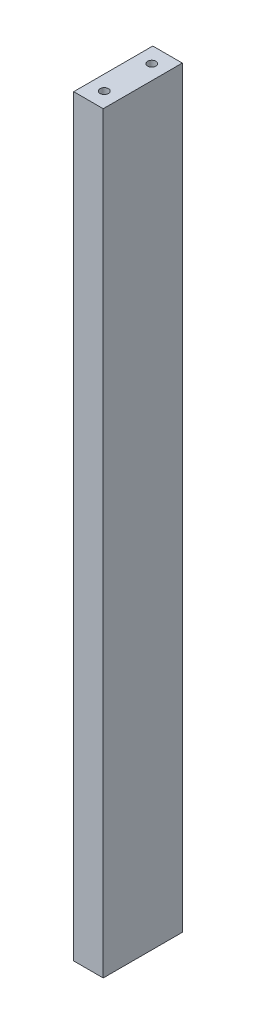
ISO-10303-21;
HEADER;
FILE_DESCRIPTION(('STEP AP214'),'2;1');
FILE_NAME('part.step','',(''),(''),'','','');
FILE_SCHEMA(('AUTOMOTIVE_DESIGN { 1 0 10303 214 1 1 1 1 }'));
ENDSEC;
DATA;
#1=APPLICATION_CONTEXT('core data for automotive mechanical design processes');
#2=APPLICATION_PROTOCOL_DEFINITION('international standard','automotive_design',2000,#1);
#3=PRODUCT_CONTEXT('',#1,'mechanical');
#4=PRODUCT('Part','Part','',(#3));
#5=PRODUCT_RELATED_PRODUCT_CATEGORY('part','',(#4));
#6=PRODUCT_DEFINITION_FORMATION('','',#4);
#7=PRODUCT_DEFINITION_CONTEXT('part definition',#1,'design');
#8=PRODUCT_DEFINITION('design','',#6,#7);
#9=PRODUCT_DEFINITION_SHAPE('','',#8);
#10=(LENGTH_UNIT() NAMED_UNIT(*) SI_UNIT(.MILLI.,.METRE.));
#11=(NAMED_UNIT(*) PLANE_ANGLE_UNIT() SI_UNIT($,.RADIAN.));
#12=(NAMED_UNIT(*) SI_UNIT($,.STERADIAN.) SOLID_ANGLE_UNIT());
#13=UNCERTAINTY_MEASURE_WITH_UNIT(LENGTH_MEASURE(1.E-05),#10,'distance_accuracy_value','');
#14=(GEOMETRIC_REPRESENTATION_CONTEXT(3) GLOBAL_UNCERTAINTY_ASSIGNED_CONTEXT((#13)) GLOBAL_UNIT_ASSIGNED_CONTEXT((#10,
#11,#12)) REPRESENTATION_CONTEXT('',''));
#15=CARTESIAN_POINT('',(0.,0.,0.));
#16=DIRECTION('',(0.,0.,1.));
#17=DIRECTION('',(1.,0.,0.));
#18=AXIS2_PLACEMENT_3D('',#15,#16,#17);
#19=CARTESIAN_POINT('',(0.,-714.,0.));
#20=DIRECTION('',(0.,-1.,0.));
#21=DIRECTION('',(0.,0.,-1.));
#22=AXIS2_PLACEMENT_3D('',#19,#20,#21);
#23=PLANE('',#22);
#24=CARTESIAN_POINT('',(-14.,-714.,-60.));
#25=DIRECTION('',(0.,1.,0.));
#26=DIRECTION('',(0.,0.,1.));
#27=AXIS2_PLACEMENT_3D('',#24,#25,#26);
#28=CIRCLE('',#27,4.00000000000001);
#29=CARTESIAN_POINT('',(-14.,-714.,-56.));
#30=VERTEX_POINT('',#29);
#31=EDGE_CURVE('E121',#30,#30,#28,.T.);
#32=ORIENTED_EDGE('',*,*,#31,.T.);
#33=EDGE_LOOP('',(#32));
#34=FACE_BOUND('',#33,.T.);
#35=DIRECTION('',(0.,0.,-1.));
#36=VECTOR('',#35,1.);
#37=CARTESIAN_POINT('',(0.,-714.,-75.));
#38=LINE('',#37,#36);
#39=CARTESIAN_POINT('',(0.,-714.,0.));
#40=VERTEX_POINT('',#39);
#41=CARTESIAN_POINT('',(0.,-714.,-75.));
#42=VERTEX_POINT('',#41);
#43=EDGE_CURVE('E83',#40,#42,#38,.T.);
#44=ORIENTED_EDGE('',*,*,#43,.F.);
#45=DIRECTION('',(1.,0.,0.));
#46=VECTOR('',#45,1.);
#47=CARTESIAN_POINT('',(0.,-714.,0.));
#48=LINE('',#47,#46);
#49=CARTESIAN_POINT('',(-28.,-714.,0.));
#50=VERTEX_POINT('',#49);
#51=EDGE_CURVE('E89',#50,#40,#48,.T.);
#52=ORIENTED_EDGE('',*,*,#51,.F.);
#53=DIRECTION('',(0.,0.,1.));
#54=VECTOR('',#53,1.);
#55=CARTESIAN_POINT('',(-28.,-714.,-75.));
#56=LINE('',#55,#54);
#57=CARTESIAN_POINT('',(-28.,-714.,-75.));
#58=VERTEX_POINT('',#57);
#59=EDGE_CURVE('E106',#58,#50,#56,.T.);
#60=ORIENTED_EDGE('',*,*,#59,.F.);
#61=DIRECTION('',(-1.,0.,0.));
#62=VECTOR('',#61,1.);
#63=CARTESIAN_POINT('',(0.,-714.,-75.));
#64=LINE('',#63,#62);
#65=EDGE_CURVE('E96',#42,#58,#64,.T.);
#66=ORIENTED_EDGE('',*,*,#65,.F.);
#67=EDGE_LOOP('',(#44,#52,#60,#66));
#68=FACE_BOUND('',#67,.T.);
#69=CARTESIAN_POINT('',(-14.,-714.,-15.));
#70=DIRECTION('',(0.,1.,0.));
#71=DIRECTION('',(0.,0.,1.));
#72=AXIS2_PLACEMENT_3D('',#69,#70,#71);
#73=CIRCLE('',#72,4.);
#74=CARTESIAN_POINT('',(-14.,-714.,-11.));
#75=VERTEX_POINT('',#74);
#76=EDGE_CURVE('E127',#75,#75,#73,.T.);
#77=ORIENTED_EDGE('',*,*,#76,.T.);
#78=EDGE_LOOP('',(#77));
#79=FACE_BOUND('',#78,.T.);
#80=ADVANCED_FACE('F34',(#34,#68,#79),#23,.T.);
#81=CARTESIAN_POINT('',(0.,80.0562302385017,-75.));
#82=DIRECTION('',(-1.,0.,0.));
#83=DIRECTION('',(0.,0.,1.));
#84=AXIS2_PLACEMENT_3D('',#81,#82,#83);
#85=PLANE('',#84);
#86=DIRECTION('',(0.,0.,-1.));
#87=VECTOR('',#86,1.);
#88=CARTESIAN_POINT('',(0.,0.,-75.));
#89=LINE('',#88,#87);
#90=CARTESIAN_POINT('',(0.,0.,0.));
#91=VERTEX_POINT('',#90);
#92=CARTESIAN_POINT('',(0.,0.,-75.));
#93=VERTEX_POINT('',#92);
#94=EDGE_CURVE('E85',#91,#93,#89,.T.);
#95=ORIENTED_EDGE('',*,*,#94,.F.);
#96=DIRECTION('',(0.,-1.,0.));
#97=VECTOR('',#96,1.);
#98=CARTESIAN_POINT('',(0.,80.0562302385017,0.));
#99=LINE('',#98,#97);
#100=EDGE_CURVE('E38',#91,#40,#99,.T.);
#101=ORIENTED_EDGE('',*,*,#100,.T.);
#102=ORIENTED_EDGE('',*,*,#43,.T.);
#103=DIRECTION('',(0.,-1.,0.));
#104=VECTOR('',#103,1.);
#105=CARTESIAN_POINT('',(0.,80.0562302385017,-75.));
#106=LINE('',#105,#104);
#107=EDGE_CURVE('E73',#93,#42,#106,.T.);
#108=ORIENTED_EDGE('',*,*,#107,.F.);
#109=EDGE_LOOP('',(#95,#101,#102,#108));
#110=FACE_BOUND('',#109,.T.);
#111=ADVANCED_FACE('F81',(#110),#85,.F.);
#112=CARTESIAN_POINT('',(0.,80.0562302385017,-75.));
#113=DIRECTION('',(0.,0.,1.));
#114=DIRECTION('',(1.,0.,0.));
#115=AXIS2_PLACEMENT_3D('',#112,#113,#114);
#116=PLANE('',#115);
#117=DIRECTION('',(-1.,0.,0.));
#118=VECTOR('',#117,1.);
#119=CARTESIAN_POINT('',(0.,0.,-75.));
#120=LINE('',#119,#118);
#121=CARTESIAN_POINT('',(-28.,0.,-75.));
#122=VERTEX_POINT('',#121);
#123=EDGE_CURVE('E43',#93,#122,#120,.T.);
#124=ORIENTED_EDGE('',*,*,#123,.F.);
#125=ORIENTED_EDGE('',*,*,#107,.T.);
#126=ORIENTED_EDGE('',*,*,#65,.T.);
#127=DIRECTION('',(0.,-1.,0.));
#128=VECTOR('',#127,1.);
#129=CARTESIAN_POINT('',(-28.,80.0562302385017,-75.));
#130=LINE('',#129,#128);
#131=EDGE_CURVE('E105',#122,#58,#130,.T.);
#132=ORIENTED_EDGE('',*,*,#131,.F.);
#133=EDGE_LOOP('',(#124,#125,#126,#132));
#134=FACE_BOUND('',#133,.T.);
#135=ADVANCED_FACE('F150',(#134),#116,.F.);
#136=CARTESIAN_POINT('',(-28.,80.0562302385017,-75.));
#137=DIRECTION('',(1.,0.,0.));
#138=DIRECTION('',(0.,0.,-1.));
#139=AXIS2_PLACEMENT_3D('',#136,#137,#138);
#140=PLANE('',#139);
#141=DIRECTION('',(0.,0.,1.));
#142=VECTOR('',#141,1.);
#143=CARTESIAN_POINT('',(-28.,0.,-75.));
#144=LINE('',#143,#142);
#145=CARTESIAN_POINT('',(-28.,0.,0.));
#146=VERTEX_POINT('',#145);
#147=EDGE_CURVE('E11',#122,#146,#144,.T.);
#148=ORIENTED_EDGE('',*,*,#147,.F.);
#149=ORIENTED_EDGE('',*,*,#131,.T.);
#150=ORIENTED_EDGE('',*,*,#59,.T.);
#151=DIRECTION('',(0.,-1.,0.));
#152=VECTOR('',#151,1.);
#153=CARTESIAN_POINT('',(-28.,80.0562302385017,0.));
#154=LINE('',#153,#152);
#155=EDGE_CURVE('E56',#146,#50,#154,.T.);
#156=ORIENTED_EDGE('',*,*,#155,.F.);
#157=EDGE_LOOP('',(#148,#149,#150,#156));
#158=FACE_BOUND('',#157,.T.);
#159=ADVANCED_FACE('F157',(#158),#140,.F.);
#160=CARTESIAN_POINT('',(0.,80.0562302385017,0.));
#161=DIRECTION('',(0.,0.,-1.));
#162=DIRECTION('',(-1.,0.,0.));
#163=AXIS2_PLACEMENT_3D('',#160,#161,#162);
#164=PLANE('',#163);
#165=DIRECTION('',(1.,0.,0.));
#166=VECTOR('',#165,1.);
#167=CARTESIAN_POINT('',(0.,0.,0.));
#168=LINE('',#167,#166);
#169=EDGE_CURVE('E93',#146,#91,#168,.T.);
#170=ORIENTED_EDGE('',*,*,#169,.F.);
#171=ORIENTED_EDGE('',*,*,#155,.T.);
#172=ORIENTED_EDGE('',*,*,#51,.T.);
#173=ORIENTED_EDGE('',*,*,#100,.F.);
#174=EDGE_LOOP('',(#170,#171,#172,#173));
#175=FACE_BOUND('',#174,.T.);
#176=ADVANCED_FACE('F90',(#175),#164,.F.);
#177=CARTESIAN_POINT('',(0.,0.,0.));
#178=DIRECTION('',(0.,1.,0.));
#179=DIRECTION('',(0.,0.,1.));
#180=AXIS2_PLACEMENT_3D('',#177,#178,#179);
#181=PLANE('',#180);
#182=CARTESIAN_POINT('',(-14.,0.,-60.));
#183=DIRECTION('',(0.,1.,0.));
#184=DIRECTION('',(0.,0.,1.));
#185=AXIS2_PLACEMENT_3D('',#182,#183,#184);
#186=CIRCLE('',#185,4.);
#187=CARTESIAN_POINT('',(-14.,0.,-56.));
#188=VERTEX_POINT('',#187);
#189=EDGE_CURVE('E115',#188,#188,#186,.T.);
#190=ORIENTED_EDGE('',*,*,#189,.F.);
#191=EDGE_LOOP('',(#190));
#192=FACE_BOUND('',#191,.T.);
#193=CARTESIAN_POINT('',(-14.,0.,-15.));
#194=DIRECTION('',(0.,1.,0.));
#195=DIRECTION('',(0.,0.,1.));
#196=AXIS2_PLACEMENT_3D('',#193,#194,#195);
#197=CIRCLE('',#196,4.);
#198=CARTESIAN_POINT('',(-14.,0.,-11.));
#199=VERTEX_POINT('',#198);
#200=EDGE_CURVE('E109',#199,#199,#197,.T.);
#201=ORIENTED_EDGE('',*,*,#200,.F.);
#202=EDGE_LOOP('',(#201));
#203=FACE_BOUND('',#202,.T.);
#204=ORIENTED_EDGE('',*,*,#169,.T.);
#205=ORIENTED_EDGE('',*,*,#94,.T.);
#206=ORIENTED_EDGE('',*,*,#123,.T.);
#207=ORIENTED_EDGE('',*,*,#147,.T.);
#208=EDGE_LOOP('',(#204,#205,#206,#207));
#209=FACE_BOUND('',#208,.T.);
#210=ADVANCED_FACE('F36',(#192,#203,#209),#181,.T.);
#211=CARTESIAN_POINT('',(-14.,-10.,-15.));
#212=DIRECTION('',(0.,1.,0.));
#213=DIRECTION('',(0.,0.,1.));
#214=AXIS2_PLACEMENT_3D('',#211,#212,#213);
#215=CYLINDRICAL_SURFACE('',#214,4.);
#216=CARTESIAN_POINT('',(-14.,-10.,-15.));
#217=DIRECTION('',(0.,1.,0.));
#218=DIRECTION('',(0.,0.,1.));
#219=AXIS2_PLACEMENT_3D('',#216,#217,#218);
#220=CIRCLE('',#219,4.);
#221=CARTESIAN_POINT('',(-14.,-10.,-11.));
#222=VERTEX_POINT('',#221);
#223=EDGE_CURVE('E87',#222,#222,#220,.T.);
#224=ORIENTED_EDGE('',*,*,#223,.F.);
#225=EDGE_LOOP('',(#224));
#226=FACE_BOUND('',#225,.T.);
#227=ORIENTED_EDGE('',*,*,#200,.T.);
#228=EDGE_LOOP('',(#227));
#229=FACE_BOUND('',#228,.T.);
#230=ADVANCED_FACE('F153',(#226,#229),#215,.F.);
#231=CARTESIAN_POINT('',(-14.,-10.,-15.));
#232=DIRECTION('',(0.,1.,0.));
#233=DIRECTION('',(0.,0.,1.));
#234=AXIS2_PLACEMENT_3D('',#231,#232,#233);
#235=PLANE('',#234);
#236=ORIENTED_EDGE('',*,*,#223,.T.);
#237=EDGE_LOOP('',(#236));
#238=FACE_BOUND('',#237,.T.);
#239=ADVANCED_FACE('F185',(#238),#235,.T.);
#240=CARTESIAN_POINT('',(-14.,-10.,-60.));
#241=DIRECTION('',(0.,1.,0.));
#242=DIRECTION('',(0.,0.,1.));
#243=AXIS2_PLACEMENT_3D('',#240,#241,#242);
#244=CYLINDRICAL_SURFACE('',#243,4.);
#245=CARTESIAN_POINT('',(-14.,-10.,-60.));
#246=DIRECTION('',(0.,1.,0.));
#247=DIRECTION('',(0.,0.,1.));
#248=AXIS2_PLACEMENT_3D('',#245,#246,#247);
#249=CIRCLE('',#248,4.);
#250=CARTESIAN_POINT('',(-14.,-10.,-56.));
#251=VERTEX_POINT('',#250);
#252=EDGE_CURVE('E112',#251,#251,#249,.T.);
#253=ORIENTED_EDGE('',*,*,#252,.F.);
#254=EDGE_LOOP('',(#253));
#255=FACE_BOUND('',#254,.T.);
#256=ORIENTED_EDGE('',*,*,#189,.T.);
#257=EDGE_LOOP('',(#256));
#258=FACE_BOUND('',#257,.T.);
#259=ADVANCED_FACE('F192',(#255,#258),#244,.F.);
#260=CARTESIAN_POINT('',(-14.,-10.,-60.));
#261=DIRECTION('',(0.,1.,0.));
#262=DIRECTION('',(0.,0.,1.));
#263=AXIS2_PLACEMENT_3D('',#260,#261,#262);
#264=PLANE('',#263);
#265=ORIENTED_EDGE('',*,*,#252,.T.);
#266=EDGE_LOOP('',(#265));
#267=FACE_BOUND('',#266,.T.);
#268=ADVANCED_FACE('F199',(#267),#264,.T.);
#269=CARTESIAN_POINT('',(-14.,-704.,-60.));
#270=DIRECTION('',(0.,-1.,0.));
#271=DIRECTION('',(0.,0.,-1.));
#272=AXIS2_PLACEMENT_3D('',#269,#270,#271);
#273=CYLINDRICAL_SURFACE('',#272,4.00000000000001);
#274=CARTESIAN_POINT('',(-14.,-704.,-60.));
#275=DIRECTION('',(0.,1.,0.));
#276=DIRECTION('',(0.,0.,1.));
#277=AXIS2_PLACEMENT_3D('',#274,#275,#276);
#278=CIRCLE('',#277,4.00000000000001);
#279=CARTESIAN_POINT('',(-14.,-704.,-56.));
#280=VERTEX_POINT('',#279);
#281=EDGE_CURVE('E118',#280,#280,#278,.T.);
#282=ORIENTED_EDGE('',*,*,#281,.T.);
#283=EDGE_LOOP('',(#282));
#284=FACE_BOUND('',#283,.T.);
#285=ORIENTED_EDGE('',*,*,#31,.F.);
#286=EDGE_LOOP('',(#285));
#287=FACE_BOUND('',#286,.T.);
#288=ADVANCED_FACE('F207',(#284,#287),#273,.F.);
#289=CARTESIAN_POINT('',(-14.,-704.,-60.));
#290=DIRECTION('',(0.,1.,0.));
#291=DIRECTION('',(0.,0.,1.));
#292=AXIS2_PLACEMENT_3D('',#289,#290,#291);
#293=PLANE('',#292);
#294=ORIENTED_EDGE('',*,*,#281,.F.);
#295=EDGE_LOOP('',(#294));
#296=FACE_BOUND('',#295,.T.);
#297=ADVANCED_FACE('F142',(#296),#293,.F.);
#298=CARTESIAN_POINT('',(-14.,-704.,-15.));
#299=DIRECTION('',(0.,-1.,0.));
#300=DIRECTION('',(0.,0.,-1.));
#301=AXIS2_PLACEMENT_3D('',#298,#299,#300);
#302=CYLINDRICAL_SURFACE('',#301,4.);
#303=CARTESIAN_POINT('',(-14.,-704.,-15.));
#304=DIRECTION('',(0.,1.,0.));
#305=DIRECTION('',(0.,0.,1.));
#306=AXIS2_PLACEMENT_3D('',#303,#304,#305);
#307=CIRCLE('',#306,4.);
#308=CARTESIAN_POINT('',(-14.,-704.,-11.));
#309=VERTEX_POINT('',#308);
#310=EDGE_CURVE('E124',#309,#309,#307,.T.);
#311=ORIENTED_EDGE('',*,*,#310,.T.);
#312=EDGE_LOOP('',(#311));
#313=FACE_BOUND('',#312,.T.);
#314=ORIENTED_EDGE('',*,*,#76,.F.);
#315=EDGE_LOOP('',(#314));
#316=FACE_BOUND('',#315,.T.);
#317=ADVANCED_FACE('F133',(#313,#316),#302,.F.);
#318=CARTESIAN_POINT('',(-14.,-704.,-15.));
#319=DIRECTION('',(0.,1.,0.));
#320=DIRECTION('',(0.,0.,1.));
#321=AXIS2_PLACEMENT_3D('',#318,#319,#320);
#322=PLANE('',#321);
#323=ORIENTED_EDGE('',*,*,#310,.F.);
#324=EDGE_LOOP('',(#323));
#325=FACE_BOUND('',#324,.T.);
#326=ADVANCED_FACE('F136',(#325),#322,.F.);
#327=CLOSED_SHELL('',(#80,#111,#135,#159,#176,#210,#230,#239,#259,#268,#288,#297,#317,#326));
#328=MANIFOLD_SOLID_BREP('B2',#327);
#329=ADVANCED_BREP_SHAPE_REPRESENTATION('',(#18,#328),#14);
#330=SHAPE_DEFINITION_REPRESENTATION(#9,#329);
ENDSEC;
END-ISO-10303-21;
